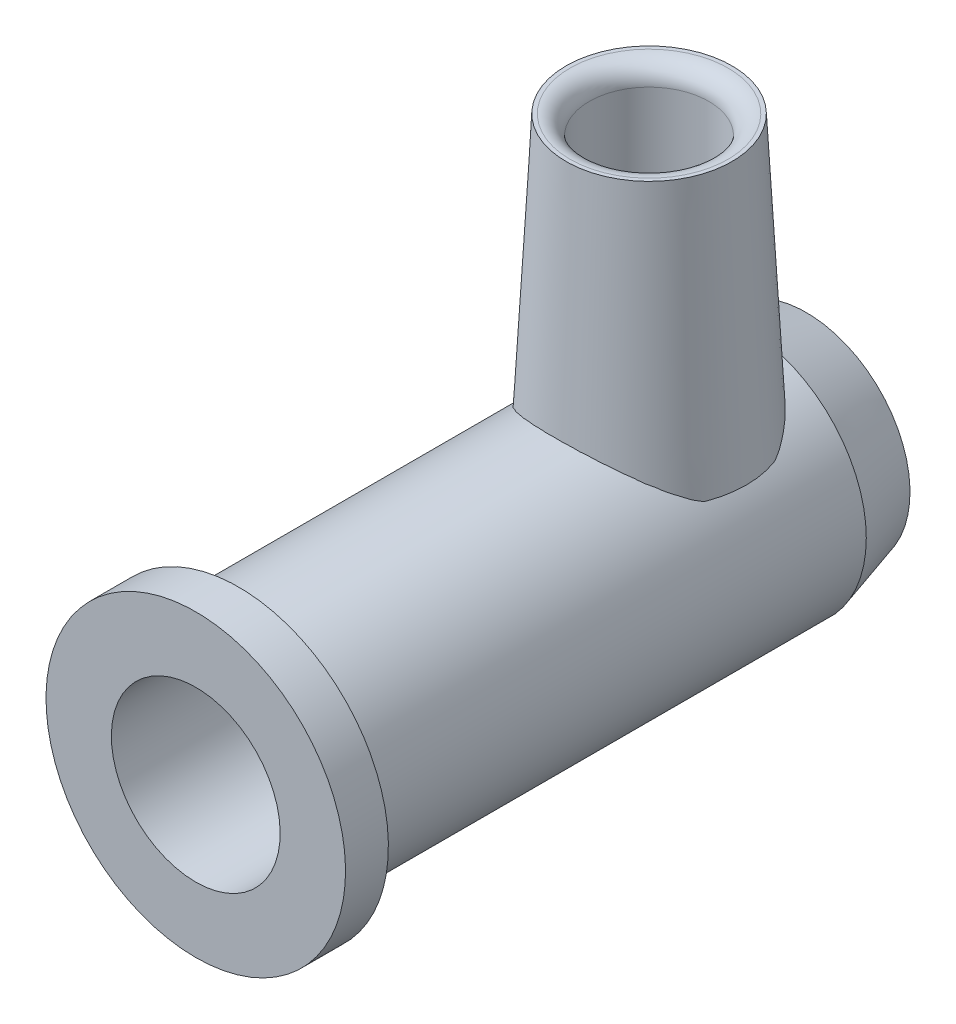
ISO-10303-21;
HEADER;
FILE_DESCRIPTION(('STEP AP214'),'2;1');
FILE_NAME('part.step','',(''),(''),'','','');
FILE_SCHEMA(('AUTOMOTIVE_DESIGN { 1 0 10303 214 1 1 1 1 }'));
ENDSEC;
DATA;
#1=APPLICATION_CONTEXT('core data for automotive mechanical design processes');
#2=APPLICATION_PROTOCOL_DEFINITION('international standard','automotive_design',2000,#1);
#3=PRODUCT_CONTEXT('',#1,'mechanical');
#4=PRODUCT('Part','Part','',(#3));
#5=PRODUCT_RELATED_PRODUCT_CATEGORY('part','',(#4));
#6=PRODUCT_DEFINITION_FORMATION('','',#4);
#7=PRODUCT_DEFINITION_CONTEXT('part definition',#1,'design');
#8=PRODUCT_DEFINITION('design','',#6,#7);
#9=PRODUCT_DEFINITION_SHAPE('','',#8);
#10=(LENGTH_UNIT() NAMED_UNIT(*) SI_UNIT(.MILLI.,.METRE.));
#11=(NAMED_UNIT(*) PLANE_ANGLE_UNIT() SI_UNIT($,.RADIAN.));
#12=(NAMED_UNIT(*) SI_UNIT($,.STERADIAN.) SOLID_ANGLE_UNIT());
#13=UNCERTAINTY_MEASURE_WITH_UNIT(LENGTH_MEASURE(1.E-05),#10,'distance_accuracy_value','');
#14=(GEOMETRIC_REPRESENTATION_CONTEXT(3) GLOBAL_UNCERTAINTY_ASSIGNED_CONTEXT((#13)) GLOBAL_UNIT_ASSIGNED_CONTEXT((#10,
#11,#12)) REPRESENTATION_CONTEXT('',''));
#15=CARTESIAN_POINT('',(0.,0.,0.));
#16=DIRECTION('',(0.,0.,1.));
#17=DIRECTION('',(1.,0.,0.));
#18=AXIS2_PLACEMENT_3D('',#15,#16,#17);
#19=CARTESIAN_POINT('',(0.,29.8061806158723,6.76268689607991));
#20=DIRECTION('',(0.,1.,0.));
#21=DIRECTION('',(0.,0.,1.));
#22=AXIS2_PLACEMENT_3D('',#19,#20,#21);
#23=PLANE('',#22);
#24=CARTESIAN_POINT('',(0.,29.8061806158723,6.76268689607991));
#25=DIRECTION('',(0.,1.,0.));
#26=DIRECTION('',(0.,0.,1.));
#27=AXIS2_PLACEMENT_3D('',#24,#25,#26);
#28=CIRCLE('',#27,2.95015);
#29=CARTESIAN_POINT('',(0.,29.8061806158723,9.71283689607991));
#30=VERTEX_POINT('',#29);
#31=EDGE_CURVE('E11',#30,#30,#28,.F.);
#32=ORIENTED_EDGE('',*,*,#31,.T.);
#33=EDGE_LOOP('',(#32));
#34=FACE_BOUND('',#33,.T.);
#35=CARTESIAN_POINT('',(0.,29.8061806158723,6.76268689607991));
#36=DIRECTION('',(0.,1.,0.));
#37=DIRECTION('',(-1.,0.,0.));
#38=AXIS2_PLACEMENT_3D('',#35,#36,#37);
#39=CIRCLE('',#38,3.09657639803037);
#40=CARTESIAN_POINT('',(-3.09657639803037,29.8061806158723,6.76268689607991));
#41=VERTEX_POINT('',#40);
#42=EDGE_CURVE('E80',#41,#41,#39,.T.);
#43=ORIENTED_EDGE('',*,*,#42,.T.);
#44=EDGE_LOOP('',(#43));
#45=FACE_BOUND('',#44,.T.);
#46=ADVANCED_FACE('F57',(#34,#45),#23,.T.);
#47=CARTESIAN_POINT('',(0.,29.8061806158723,6.76268689607991));
#48=DIRECTION('',(0.,-1.,0.));
#49=DIRECTION('',(0.,0.,-1.));
#50=AXIS2_PLACEMENT_3D('',#47,#48,#49);
#51=CYLINDRICAL_SURFACE('',#50,2.23165);
#52=CARTESIAN_POINT('',(0.,29.0876806158723,6.76268689607991));
#53=DIRECTION('',(0.,1.,0.));
#54=DIRECTION('',(0.,0.,1.));
#55=AXIS2_PLACEMENT_3D('',#52,#53,#54);
#56=CIRCLE('',#55,2.23165);
#57=CARTESIAN_POINT('',(0.,29.0876806158723,8.99433689607991));
#58=VERTEX_POINT('',#57);
#59=EDGE_CURVE('E64',#58,#58,#56,.T.);
#60=ORIENTED_EDGE('',*,*,#59,.T.);
#61=EDGE_LOOP('',(#60));
#62=FACE_BOUND('',#61,.T.);
#63=CARTESIAN_POINT('',(0.,21.1161806158723,6.76268689607991));
#64=DIRECTION('',(0.,1.,0.));
#65=DIRECTION('',(0.,0.,1.));
#66=AXIS2_PLACEMENT_3D('',#63,#64,#65);
#67=CIRCLE('',#66,2.23165);
#68=CARTESIAN_POINT('',(0.,21.1161806158723,8.99433689607991));
#69=VERTEX_POINT('',#68);
#70=EDGE_CURVE('E68',#69,#69,#67,.T.);
#71=ORIENTED_EDGE('',*,*,#70,.F.);
#72=EDGE_LOOP('',(#71));
#73=FACE_BOUND('',#72,.T.);
#74=ADVANCED_FACE('F88',(#62,#73),#51,.F.);
#75=CARTESIAN_POINT('',(0.,21.1161806158723,6.76268689607991));
#76=DIRECTION('',(0.,-1.,0.));
#77=DIRECTION('',(-1.,0.,0.));
#78=AXIS2_PLACEMENT_3D('',#75,#76,#77);
#79=CONICAL_SURFACE('',#78,3.552,0.05235987755983);
#80=CARTESIAN_POINT('',(0.,19.6161806158723,6.76268689607991));
#81=DIRECTION('',(0.,1.,0.));
#82=DIRECTION('',(-1.,0.,0.));
#83=AXIS2_PLACEMENT_3D('',#80,#81,#82);
#84=CIRCLE('',#83,3.63061166892456);
#85=CARTESIAN_POINT('',(-3.63061166892456,19.6161806158723,6.76268689607991));
#86=VERTEX_POINT('',#85);
#87=EDGE_CURVE('E72',#86,#86,#84,.T.);
#88=ORIENTED_EDGE('',*,*,#87,.T.);
#89=EDGE_LOOP('',(#88));
#90=FACE_BOUND('',#89,.T.);
#91=ORIENTED_EDGE('',*,*,#42,.F.);
#92=EDGE_LOOP('',(#91));
#93=FACE_BOUND('',#92,.T.);
#94=ADVANCED_FACE('F85',(#90,#93),#79,.T.);
#95=CARTESIAN_POINT('',(0.,19.6161806158723,6.76268689607991));
#96=DIRECTION('',(0.,1.,0.));
#97=DIRECTION('',(-1.,0.,0.));
#98=AXIS2_PLACEMENT_3D('',#95,#96,#97);
#99=PLANE('',#98);
#100=CARTESIAN_POINT('',(0.,19.6161806158723,6.76268689607991));
#101=DIRECTION('',(0.,1.,0.));
#102=DIRECTION('',(-1.,0.,0.));
#103=AXIS2_PLACEMENT_3D('',#100,#101,#102);
#104=CIRCLE('',#103,2.15303833107544);
#105=CARTESIAN_POINT('',(-2.15303833107544,19.6161806158723,6.76268689607991));
#106=VERTEX_POINT('',#105);
#107=EDGE_CURVE('E77',#106,#106,#104,.T.);
#108=ORIENTED_EDGE('',*,*,#107,.T.);
#109=EDGE_LOOP('',(#108));
#110=FACE_BOUND('',#109,.T.);
#111=ORIENTED_EDGE('',*,*,#87,.F.);
#112=EDGE_LOOP('',(#111));
#113=FACE_BOUND('',#112,.T.);
#114=ADVANCED_FACE('F87',(#110,#113),#99,.F.);
#115=CARTESIAN_POINT('',(0.,21.1161806158723,6.76268689607991));
#116=DIRECTION('',(0.,1.,0.));
#117=DIRECTION('',(-1.,0.,0.));
#118=AXIS2_PLACEMENT_3D('',#115,#116,#117);
#119=CONICAL_SURFACE('',#118,2.23165,0.05235987755983);
#120=ORIENTED_EDGE('',*,*,#70,.T.);
#121=EDGE_LOOP('',(#120));
#122=FACE_BOUND('',#121,.T.);
#123=ORIENTED_EDGE('',*,*,#107,.F.);
#124=EDGE_LOOP('',(#123));
#125=FACE_BOUND('',#124,.T.);
#126=ADVANCED_FACE('F94',(#122,#125),#119,.F.);
#127=CARTESIAN_POINT('',(0.,29.0876806158723,6.76268689607991));
#128=DIRECTION('',(0.,1.,0.));
#129=DIRECTION('',(0.,0.,1.));
#130=AXIS2_PLACEMENT_3D('',#127,#128,#129);
#131=TOROIDAL_SURFACE('',#130,2.95015,0.7185);
#132=ORIENTED_EDGE('',*,*,#31,.F.);
#133=EDGE_LOOP('',(#132));
#134=FACE_BOUND('',#133,.T.);
#135=ORIENTED_EDGE('',*,*,#59,.F.);
#136=EDGE_LOOP('',(#135));
#137=FACE_BOUND('',#136,.T.);
#138=ADVANCED_FACE('F59',(#134,#137),#131,.T.);
#139=CLOSED_SHELL('',(#46,#74,#94,#114,#126,#138));
#140=MANIFOLD_SOLID_BREP('B2',#139);
#141=CARTESIAN_POINT('',(0.,16.5755186730847,25.7651293089935));
#142=DIRECTION('',(0.,0.,1.));
#143=DIRECTION('',(0.,-1.,0.));
#144=AXIS2_PLACEMENT_3D('',#141,#142,#143);
#145=CYLINDRICAL_SURFACE('',#144,5.59);
#146=CARTESIAN_POINT('',(0.,16.5755186730847,22.0826868960799));
#147=DIRECTION('',(0.,0.,1.));
#148=DIRECTION('',(0.,-1.,0.));
#149=AXIS2_PLACEMENT_3D('',#146,#147,#148);
#150=CIRCLE('',#149,5.59);
#151=CARTESIAN_POINT('',(0.,10.9855186730847,22.0826868960799));
#152=VERTEX_POINT('',#151);
#153=EDGE_CURVE('E182',#152,#152,#150,.T.);
#154=ORIENTED_EDGE('',*,*,#153,.T.);
#155=EDGE_LOOP('',(#154));
#156=FACE_BOUND('',#155,.T.);
#157=CARTESIAN_POINT('',(0.,16.5755186730847,23.6826868960799));
#158=DIRECTION('',(0.,0.,1.));
#159=DIRECTION('',(0.,-1.,0.));
#160=AXIS2_PLACEMENT_3D('',#157,#158,#159);
#161=CIRCLE('',#160,5.59);
#162=CARTESIAN_POINT('',(0.,10.9855186730847,23.6826868960799));
#163=VERTEX_POINT('',#162);
#164=EDGE_CURVE('E191',#163,#163,#161,.T.);
#165=ORIENTED_EDGE('',*,*,#164,.F.);
#166=EDGE_LOOP('',(#165));
#167=FACE_BOUND('',#166,.T.);
#168=ADVANCED_FACE('F152',(#156,#167),#145,.T.);
#169=CARTESIAN_POINT('',(0.,10.9855186730847,22.0826868960799));
#170=DIRECTION('',(0.,0.,-1.));
#171=DIRECTION('',(0.,1.,0.));
#172=AXIS2_PLACEMENT_3D('',#169,#170,#171);
#173=PLANE('',#172);
#174=CARTESIAN_POINT('',(0.,16.5755186730847,22.0826868960799));
#175=DIRECTION('',(0.,0.,1.));
#176=DIRECTION('',(0.,-1.,0.));
#177=AXIS2_PLACEMENT_3D('',#174,#175,#176);
#178=CIRCLE('',#177,4.54066194278755);
#179=CARTESIAN_POINT('',(0.,12.0348567302972,22.0826868960799));
#180=VERTEX_POINT('',#179);
#181=EDGE_CURVE('E214',#180,#180,#178,.T.);
#182=ORIENTED_EDGE('',*,*,#181,.T.);
#183=EDGE_LOOP('',(#182));
#184=FACE_BOUND('',#183,.T.);
#185=ORIENTED_EDGE('',*,*,#153,.F.);
#186=EDGE_LOOP('',(#185));
#187=FACE_BOUND('',#186,.T.);
#188=ADVANCED_FACE('F223',(#184,#187),#173,.T.);
#189=CARTESIAN_POINT('',(0.,16.5755186730847,25.7651293089935));
#190=DIRECTION('',(0.,0.,1.));
#191=DIRECTION('',(0.,-1.,0.));
#192=AXIS2_PLACEMENT_3D('',#189,#190,#191);
#193=CYLINDRICAL_SURFACE('',#192,4.54066194278755);
#194=CARTESIAN_POINT('',(-2.23165,20.5299274982037,6.76268689607991));
#195=CARTESIAN_POINT('',(-2.23164095314419,20.5299383244512,6.87927581101539));
#196=CARTESIAN_POINT('',(-2.22245219435208,20.5351620440469,6.99602333077688));
#197=CARTESIAN_POINT('',(-2.18615144640278,20.5553121418181,7.22595728341037));
#198=CARTESIAN_POINT('',(-2.15900051728307,20.5702595987839,7.33913541853749));
#199=CARTESIAN_POINT('',(-2.08821416130668,20.6077081192122,7.55817667453163));
#200=CARTESIAN_POINT('',(-2.04466404277252,20.630170026282,7.66407435332051));
#201=CARTESIAN_POINT('',(-1.94257504555127,20.6800564932529,7.8670340532073));
#202=CARTESIAN_POINT('',(-1.88403579844574,20.7074811751294,7.96409585704835));
#203=CARTESIAN_POINT('',(-1.7481670907413,20.7668713944891,8.1551609557438));
#204=CARTESIAN_POINT('',(-1.66971337183432,20.7990246070644,8.24830682675954));
#205=CARTESIAN_POINT('',(-1.49858315443303,20.8627319001881,8.42078196815478));
#206=CARTESIAN_POINT('',(-1.40589980347436,20.8942856838027,8.50010454224183));
#207=CARTESIAN_POINT('',(-1.20162165774761,20.9556778935301,8.64769098657378));
#208=CARTESIAN_POINT('',(-1.08919203860061,20.9852738890338,8.71490966122146));
#209=CARTESIAN_POINT('',(-0.852894000173005,21.0369947911009,8.82908936143857));
#210=CARTESIAN_POINT('',(-0.729032617189068,21.0591242548019,8.87606274843058));
#211=CARTESIAN_POINT('',(-0.482463033510655,21.0920686974689,8.94505420461192));
#212=CARTESIAN_POINT('',(-0.360267194409806,21.1035601700147,8.96857312780836));
#213=CARTESIAN_POINT('',(-0.11316443994599,21.1164520928663,8.99492069465956));
#214=CARTESIAN_POINT('',(0.0117408557111758,21.1178584139102,8.99776137548513));
#215=CARTESIAN_POINT('',(0.249474307710772,21.1107509384672,8.98327392254568));
#216=CARTESIAN_POINT('',(0.362434796280891,21.1030613945624,8.96762172640569));
#217=CARTESIAN_POINT('',(0.583884379878533,21.0798596716859,8.91957816354691));
#218=CARTESIAN_POINT('',(0.692373140524734,21.0643469088631,8.88718554747681));
#219=CARTESIAN_POINT('',(0.903725360574116,21.0266521668057,8.8063436207077));
#220=CARTESIAN_POINT('',(1.00648722759677,21.0043787290292,8.75767311931157));
#221=CARTESIAN_POINT('',(1.20263890233141,20.9551888729939,8.64594881358811));
#222=CARTESIAN_POINT('',(1.29602530354745,20.9282707767264,8.58288980836038));
#223=CARTESIAN_POINT('',(1.47995261664581,20.8694111323533,8.43749472566252));
#224=CARTESIAN_POINT('',(1.56943855776322,20.8372352522338,8.35391783207132));
#225=CARTESIAN_POINT('',(1.73368255527764,20.7731067027715,8.17319509283591));
#226=CARTESIAN_POINT('',(1.8084299430807,20.7411542111494,8.07603950446345));
#227=CARTESIAN_POINT('',(1.94543781289374,20.679039089712,7.86378586424098));
#228=CARTESIAN_POINT('',(2.00668453588873,20.6490976895604,7.74796236137594));
#229=CARTESIAN_POINT('',(2.10836231655825,20.5974219060408,7.50583162591815));
#230=CARTESIAN_POINT('',(2.14881447525235,20.5756792091384,7.37953517239759));
#231=CARTESIAN_POINT('',(2.20453522416153,20.5452260335474,7.13047167622944));
#232=CARTESIAN_POINT('',(2.22152784235726,20.5356283513564,7.00820273030085));
#233=CARTESIAN_POINT('',(2.23504056275008,20.5280218087882,6.76221181697989));
#234=CARTESIAN_POINT('',(2.23157404110226,20.530005376598,6.63849085171809));
#235=CARTESIAN_POINT('',(2.20584917862315,20.5443979597626,6.4068005704136));
#236=CARTESIAN_POINT('',(2.18558140002163,20.5557019857334,6.29853059407867));
#237=CARTESIAN_POINT('',(2.12974921432497,20.5858525657575,6.08712016919687));
#238=CARTESIAN_POINT('',(2.09418005682331,20.6047014620355,5.98398132474427));
#239=CARTESIAN_POINT('',(2.00700516340431,20.6488495064017,5.78032669946752));
#240=CARTESIAN_POINT('',(1.95473155944625,20.6744074943604,5.680155017612));
#241=CARTESIAN_POINT('',(1.83622087084628,20.7288491402043,5.48943300876468));
#242=CARTESIAN_POINT('',(1.76997665480996,20.7577344931352,5.39888763122678));
#243=CARTESIAN_POINT('',(1.61603164144498,20.8197776856849,5.21853562308793));
#244=CARTESIAN_POINT('',(1.52670471901544,20.853029705676,5.13014305586737));
#245=CARTESIAN_POINT('',(1.33392736230289,20.9170115048806,4.96917892904806));
#246=CARTESIAN_POINT('',(1.23047267560927,20.9477405202017,4.89661215010395));
#247=CARTESIAN_POINT('',(1.00904500207698,21.0041496255696,4.76798253159981));
#248=CARTESIAN_POINT('',(0.890791978535985,21.0296967755092,4.7123393871765));
#249=CARTESIAN_POINT('',(0.644988353657957,21.0718613585502,4.62227961368046));
#250=CARTESIAN_POINT('',(0.517445745310373,21.0884863677664,4.58784497201474));
#251=CARTESIAN_POINT('',(0.269040468507309,21.1097614353717,4.54405354032891));
#252=CARTESIAN_POINT('',(0.148605326148576,21.1153521565271,4.53272375115));
#253=CARTESIAN_POINT('',(-0.0925540201675414,21.1168360956571,4.52970200750006));
#254=CARTESIAN_POINT('',(-0.213278116917651,21.112732479007,4.53800364301732));
#255=CARTESIAN_POINT('',(-0.443686803612518,21.0958372086424,4.57267900930232));
#256=CARTESIAN_POINT('',(-0.553590692314388,21.083602510721,4.59789511814186));
#257=CARTESIAN_POINT('',(-0.767443979486391,21.0521613707196,4.6641566960385));
#258=CARTESIAN_POINT('',(-0.87139249319561,21.0329538958219,4.70520451016654));
#259=CARTESIAN_POINT('',(-1.07546871760188,20.9882692132895,4.80385229006088));
#260=CARTESIAN_POINT('',(-1.17523151009425,20.9625548980863,4.86209663310791));
#261=CARTESIAN_POINT('',(-1.36398885395036,20.9075881060151,4.99266319853826));
#262=CARTESIAN_POINT('',(-1.45297841581971,20.8783340021818,5.06499190378356));
#263=CARTESIAN_POINT('',(-1.6267056842849,20.8158913494397,5.22979171781957));
#264=CARTESIAN_POINT('',(-1.71020432827075,20.7825955533442,5.32353304447512));
#265=CARTESIAN_POINT('',(-1.860710401958,20.7182328994428,5.52422708602368));
#266=CARTESIAN_POINT('',(-1.92770407141581,20.6871679166554,5.63119071357726));
#267=CARTESIAN_POINT('',(-2.04474559848781,20.6302696004204,5.85931239270491));
#268=CARTESIAN_POINT('',(-2.09429652752632,20.6045969956644,5.98077182144112));
#269=CARTESIAN_POINT('',(-2.15221521425044,20.5737740240394,6.16893017442956));
#270=CARTESIAN_POINT('',(-2.16877918048873,20.5647853908555,6.23258378281451));
#271=CARTESIAN_POINT('',(-2.1962635579718,20.5497213879184,6.36142069673177));
#272=CARTESIAN_POINT('',(-2.20718796220182,20.5436439571637,6.42660288570235));
#273=CARTESIAN_POINT('',(-2.22067020636876,20.5361086194756,6.53702514595378));
#274=CARTESIAN_POINT('',(-2.22478329730473,20.5337965955368,6.58202433977261));
#275=CARTESIAN_POINT('',(-2.23027503660906,20.5307038856506,6.67223668623508));
#276=CARTESIAN_POINT('',(-2.23165351022232,20.5299232975691,6.71744985236751));
#277=CARTESIAN_POINT('',(-2.23165,20.5299274982037,6.76268689607991));
#278=B_SPLINE_CURVE_WITH_KNOTS('',3,(#194,#195,#196,#197,#198,#199,#200,#201,#202,#203,#204,
#205,#206,#207,#208,#209,#210,#211,#212,#213,#214,#215,#216,#217,#218,#219,#220,#221,#222,#223,
#224,#225,#226,#227,#228,#229,#230,#231,#232,#233,#234,#235,#236,#237,#238,#239,#240,#241,#242,
#243,#244,#245,#246,#247,#248,#249,#250,#251,#252,#253,#254,#255,#256,#257,#258,#259,#260,#261,
#262,#263,#264,#265,#266,#267,#268,#269,#270,#271,#272,#273,#274,#275,#276,#277),.UNSPECIFIED.,
.T.,.F.,(4,2,2,2,2,2,2,2,2,2,2,2,2,2,2,2,2,2,2,2,2,2,2,2,2,2,2,2,2,2,2,2,2,2,2,2,2,2,2,2,2,4),
(0.,0.349584288259429,0.699928930263591,1.04847571235628,1.39703106221801,1.7733119685744,
2.14977464957416,2.55055288903768,2.9510860723652,3.32392656332367,3.69654999986536,
4.03783898617562,4.37915344684259,4.72530819813788,5.07158827006367,5.44977385248301,
5.82823218996093,6.22931778585427,6.62999557782216,6.99929684843668,7.36835669719011,
7.69905854779324,8.02986314098302,8.37602615322795,8.72236629630211,9.11059830549044,
9.49894742986843,9.89626217293997,10.2932390056291,10.6545948316301,11.0158326847756,
11.3545746964833,11.6933669036249,12.0469496160318,12.4006954646469,12.7885788694822,
13.1767845677262,13.5752932128453,13.7741854027421,13.9729365769737,14.1085682468864,
14.2442085840309),.UNSPECIFIED.);
#279=CARTESIAN_POINT('',(0.,21.1161806158723,8.99433689607991));
#280=VERTEX_POINT('',#279);
#281=CARTESIAN_POINT('',(0.,21.1161806158723,4.53103689607991));
#282=VERTEX_POINT('',#281);
#283=EDGE_CURVE('E55',#280,#282,#278,.T.);
#284=ORIENTED_EDGE('',*,*,#283,.F.);
#285=EDGE_CURVE('E155',#282,#280,#278,.T.);
#286=ORIENTED_EDGE('',*,*,#285,.F.);
#287=EDGE_LOOP('',(#284,#286));
#288=FACE_BOUND('',#287,.T.);
#289=CARTESIAN_POINT('',(0.,16.5755186730847,3.1946868960799));
#290=DIRECTION('',(0.,0.,1.));
#291=DIRECTION('',(0.,-1.,0.));
#292=AXIS2_PLACEMENT_3D('',#289,#290,#291);
#293=CIRCLE('',#292,4.54066194278755);
#294=CARTESIAN_POINT('',(0.,12.0348567302972,3.1946868960799));
#295=VERTEX_POINT('',#294);
#296=EDGE_CURVE('E210',#295,#295,#293,.T.);
#297=ORIENTED_EDGE('',*,*,#296,.T.);
#298=EDGE_LOOP('',(#297));
#299=FACE_BOUND('',#298,.T.);
#300=ORIENTED_EDGE('',*,*,#181,.F.);
#301=EDGE_LOOP('',(#300));
#302=FACE_BOUND('',#301,.T.);
#303=ADVANCED_FACE('F171',(#288,#299,#302),#193,.T.);
#304=CARTESIAN_POINT('',(0.,16.5755186730847,3.1946868960799));
#305=DIRECTION('',(0.,0.,1.));
#306=DIRECTION('',(0.,-1.,0.));
#307=AXIS2_PLACEMENT_3D('',#304,#305,#306);
#308=CONICAL_SURFACE('',#307,4.54066194278755,0.283491930751028);
#309=CARTESIAN_POINT('',(0.,16.5755186730847,0.892686896079908));
#310=DIRECTION('',(0.,0.,1.));
#311=DIRECTION('',(0.,-1.,0.));
#312=AXIS2_PLACEMENT_3D('',#309,#310,#311);
#313=CIRCLE('',#312,3.87000000000001);
#314=CARTESIAN_POINT('',(0.,12.7055186730847,0.892686896079908));
#315=VERTEX_POINT('',#314);
#316=EDGE_CURVE('E206',#315,#315,#313,.T.);
#317=ORIENTED_EDGE('',*,*,#316,.T.);
#318=EDGE_LOOP('',(#317));
#319=FACE_BOUND('',#318,.T.);
#320=ORIENTED_EDGE('',*,*,#296,.F.);
#321=EDGE_LOOP('',(#320));
#322=FACE_BOUND('',#321,.T.);
#323=ADVANCED_FACE('F231',(#319,#322),#308,.T.);
#324=CARTESIAN_POINT('',(0.,12.7055186730847,0.892686896079908));
#325=DIRECTION('',(0.,0.,-1.));
#326=DIRECTION('',(0.,1.,0.));
#327=AXIS2_PLACEMENT_3D('',#324,#325,#326);
#328=PLANE('',#327);
#329=CARTESIAN_POINT('',(0.,16.5755186730847,0.892686896079908));
#330=DIRECTION('',(0.,0.,1.));
#331=DIRECTION('',(0.,-1.,0.));
#332=AXIS2_PLACEMENT_3D('',#329,#330,#331);
#333=CIRCLE('',#332,3.15);
#334=CARTESIAN_POINT('',(0.,13.4255186730847,0.892686896079908));
#335=VERTEX_POINT('',#334);
#336=EDGE_CURVE('E202',#335,#335,#333,.T.);
#337=ORIENTED_EDGE('',*,*,#336,.T.);
#338=EDGE_LOOP('',(#337));
#339=FACE_BOUND('',#338,.T.);
#340=ORIENTED_EDGE('',*,*,#316,.F.);
#341=EDGE_LOOP('',(#340));
#342=FACE_BOUND('',#341,.T.);
#343=ADVANCED_FACE('F235',(#339,#342),#328,.T.);
#344=CARTESIAN_POINT('',(0.,16.5755186730847,25.7651293089935));
#345=DIRECTION('',(0.,0.,1.));
#346=DIRECTION('',(0.,-1.,0.));
#347=AXIS2_PLACEMENT_3D('',#344,#345,#346);
#348=CYLINDRICAL_SURFACE('',#347,3.15);
#349=CARTESIAN_POINT('',(0.,13.4255186730847,5.22268689607991));
#350=CARTESIAN_POINT('',(-0.0811750226638904,13.4255229014196,5.22269181864257));
#351=CARTESIAN_POINT('',(-0.162453194694666,13.4286904491245,5.2291428943405));
#352=CARTESIAN_POINT('',(-0.322620839125244,13.441048998415,5.2546682618254));
#353=CARTESIAN_POINT('',(-0.401505179584842,13.4502520993968,5.27376791079997));
#354=CARTESIAN_POINT('',(-0.55432120802518,13.4737156313306,5.32367213620284));
#355=CARTESIAN_POINT('',(-0.628270593857936,13.4879566916733,5.3544319122014));
#356=CARTESIAN_POINT('',(-0.769856044314784,13.5201789051328,5.42655817824399));
#357=CARTESIAN_POINT('',(-0.83749279006094,13.538159654067,5.46792352215818));
#358=CARTESIAN_POINT('',(-0.968991896740787,13.5774300389313,5.5628492143087));
#359=CARTESIAN_POINT('',(-1.03240098233834,13.5988518134684,5.61698203893657));
#360=CARTESIAN_POINT('',(-1.14965472347871,13.6421404475898,5.73467767219691));
#361=CARTESIAN_POINT('',(-1.20349243328993,13.6640076176656,5.79824726799263));
#362=CARTESIAN_POINT('',(-1.3040245566394,13.7075510511465,5.93860889712498));
#363=CARTESIAN_POINT('',(-1.34990623195815,13.7290958604443,6.01602854906806));
#364=CARTESIAN_POINT('',(-1.42780350362072,13.7673567434449,6.17865796059705));
#365=CARTESIAN_POINT('',(-1.45982867184362,13.7840761478023,6.26386229319976));
#366=CARTESIAN_POINT('',(-1.507076009575,13.8093107919512,6.43452549032715));
#367=CARTESIAN_POINT('',(-1.52317353868485,13.8182497059927,6.51967631943212));
#368=CARTESIAN_POINT('',(-1.54079967122265,13.8280562073909,6.69190104670738));
#369=CARTESIAN_POINT('',(-1.54234156695583,13.8289311587968,6.77897311752257));
#370=CARTESIAN_POINT('',(-1.53145668143801,13.8228545388761,6.94199432522679));
#371=CARTESIAN_POINT('',(-1.52058966370974,13.8167767477051,7.01808790711926));
#372=CARTESIAN_POINT('',(-1.4878855121457,13.7990029595217,7.1671927857685));
#373=CARTESIAN_POINT('',(-1.46604513157398,13.7873052997797,7.24020316334963));
#374=CARTESIAN_POINT('',(-1.4116031532345,13.7593462182203,7.3831431602608));
#375=CARTESIAN_POINT('',(-1.37876248745335,13.7429847335122,7.45296123581274));
#376=CARTESIAN_POINT('',(-1.30343248592544,13.7075412212938,7.586423827749));
#377=CARTESIAN_POINT('',(-1.26093883818523,13.6884579793948,7.65006556697181));
#378=CARTESIAN_POINT('',(-1.16153164750742,13.6469389915284,7.77744404207215));
#379=CARTESIAN_POINT('',(-1.10349744929506,13.6243763850322,7.84026785273383));
#380=CARTESIAN_POINT('',(-0.977602590605205,13.5803156443005,7.95566151594147));
#381=CARTESIAN_POINT('',(-0.909737645052301,13.5588179797695,8.00822687340744));
#382=CARTESIAN_POINT('',(-0.762430742653692,13.5181875697308,8.10370171521113));
#383=CARTESIAN_POINT('',(-0.682618824398829,13.4991945389378,8.14610461383486));
#384=CARTESIAN_POINT('',(-0.515829335584364,13.4668834668679,8.21654287526391));
#385=CARTESIAN_POINT('',(-0.428857276051068,13.4535611088241,8.24458917025819));
#386=CARTESIAN_POINT('',(-0.257711384112537,13.4349947267559,8.28329641349092));
#387=CARTESIAN_POINT('',(-0.173874077413556,13.4291876932171,8.29517304384764));
#388=CARTESIAN_POINT('',(-0.00520722027072472,13.4243954134054,8.30499015510634));
#389=CARTESIAN_POINT('',(0.0796218736715581,13.4254071431233,8.30293681371898));
#390=CARTESIAN_POINT('',(0.241255463498452,13.4338042735979,8.28568276179417));
#391=CARTESIAN_POINT('',(0.31819210291181,13.4407166317626,8.27145764480923));
#392=CARTESIAN_POINT('',(0.468441415084598,13.4596241364688,8.23176901626741));
#393=CARTESIAN_POINT('',(0.541753679205283,13.471619854693,8.20630424066754));
#394=CARTESIAN_POINT('',(0.685161242653909,13.500041751105,8.14415098460734));
#395=CARTESIAN_POINT('',(0.755098234776427,13.5165879943577,8.1071540727606));
#396=CARTESIAN_POINT('',(0.888009493272372,13.5524926764732,8.02332950587047));
#397=CARTESIAN_POINT('',(0.950980726196998,13.571852332096,7.97649759341171));
#398=CARTESIAN_POINT('',(1.07449750648671,13.6136613485593,7.86919787552815));
#399=CARTESIAN_POINT('',(1.13424690608155,13.6362296166204,7.80785817907333));
#400=CARTESIAN_POINT('',(1.24294523951049,13.6805162108102,7.67592249340241));
#401=CARTESIAN_POINT('',(1.29188750954352,13.7022340057761,7.60532083568176));
#402=CARTESIAN_POINT('',(1.37952489966896,13.7432306009038,7.45301374752177));
#403=CARTESIAN_POINT('',(1.41769242509016,13.7623654184194,7.37096263026549));
#404=CARTESIAN_POINT('',(1.47926999080117,13.7942453519337,7.20035992489361));
#405=CARTESIAN_POINT('',(1.50269819313984,13.8069983277661,7.11181648761455));
#406=CARTESIAN_POINT('',(1.5320416508135,13.8231372407098,6.93970234364599));
#407=CARTESIAN_POINT('',(1.53940142786482,13.827293820677,6.8564513224222));
#408=CARTESIAN_POINT('',(1.54052752945954,13.8279235125212,6.68984191641798));
#409=CARTESIAN_POINT('',(1.53429893992593,13.8243994991303,6.6064835834738));
#410=CARTESIAN_POINT('',(1.50976008304721,13.810868727922,6.44968345194853));
#411=CARTESIAN_POINT('',(1.49255293722776,13.8014552677191,6.37601156275341));
#412=CARTESIAN_POINT('',(1.44786640978942,13.7778737172849,6.23266486069883));
#413=CARTESIAN_POINT('',(1.42038382619735,13.7637041451221,6.16299130159069));
#414=CARTESIAN_POINT('',(1.35384695638808,13.7310403661855,6.02444793259979));
#415=CARTESIAN_POINT('',(1.31413896266786,13.7123194712651,5.95594702239222));
#416=CARTESIAN_POINT('',(1.22502483551469,13.673074181014,5.82614044449284));
#417=CARTESIAN_POINT('',(1.1756137969393,13.652548876418,5.76483844118791));
#418=CARTESIAN_POINT('',(1.06186746354126,13.6091999186622,5.64389710205309));
#419=CARTESIAN_POINT('',(0.99647214514954,13.5863815266659,5.58524744225227));
#420=CARTESIAN_POINT('',(0.856091846304387,13.5431936496296,5.47955595780963));
#421=CARTESIAN_POINT('',(0.7811019762248,13.5228254235971,5.43252008790937));
#422=CARTESIAN_POINT('',(0.623059301498485,13.486686775035,5.35155270777378));
#423=CARTESIAN_POINT('',(0.539987285315283,13.4709276829124,5.31765342524685));
#424=CARTESIAN_POINT('',(0.368437678749995,13.4459485823112,5.26473475463008));
#425=CARTESIAN_POINT('',(0.27997651861126,13.4367096823147,5.24567236168592));
#426=CARTESIAN_POINT('',(0.158891038669534,13.4293677137214,5.23057331463043));
#427=CARTESIAN_POINT('',(0.127207622609459,13.4279277648857,5.22761973044011));
#428=CARTESIAN_POINT('',(0.063688100919103,13.4260024023695,5.22367552942407));
#429=CARTESIAN_POINT('',(0.0318519912714756,13.4255170139428,5.22268496453228));
#430=CARTESIAN_POINT('',(0.,13.4255186730847,5.22268689607991));
#431=B_SPLINE_CURVE_WITH_KNOTS('',3,(#349,#350,#351,#352,#353,#354,#355,#356,#357,#358,#359,
#360,#361,#362,#363,#364,#365,#366,#367,#368,#369,#370,#371,#372,#373,#374,#375,#376,#377,#378,
#379,#380,#381,#382,#383,#384,#385,#386,#387,#388,#389,#390,#391,#392,#393,#394,#395,#396,#397,
#398,#399,#400,#401,#402,#403,#404,#405,#406,#407,#408,#409,#410,#411,#412,#413,#414,#415,#416,
#417,#418,#419,#420,#421,#422,#423,#424,#425,#426,#427,#428,#429,#430),.UNSPECIFIED.,.T.,.F.,(4,
2,2,2,2,2,2,2,2,2,2,2,2,2,2,2,2,2,2,2,2,2,2,2,2,2,2,2,2,2,2,2,2,2,2,2,2,2,2,2,4),(0.,
0.243395530813617,0.487280491184209,0.73023774391609,0.973168751635,1.23033208034717,
1.48768127164227,1.76389194228634,2.03991150469295,2.29974199886325,2.55933519104722,
2.78957545513792,3.01988388155493,3.25556295193958,3.49134750806847,3.75554840858363,
4.01986481878605,4.29543834052916,4.57080170670777,4.82404305122695,5.07717209476819,
5.31173061094744,5.54631551294788,5.78780843229205,6.02940610636346,6.29391174338464,
6.55858002500251,6.83456441528864,7.1102080633123,7.35982933654322,7.60935719628319,
7.83708382033559,8.06488146648028,8.30799278344472,8.55122731738205,8.82224421529133,
9.09339978454948,9.36521642509987,9.63624223799157,9.7317448565564,9.82725000171776),.UNSPECIFIED.);
#432=CARTESIAN_POINT('',(0.,13.4255186730847,5.22268689607991));
#433=VERTEX_POINT('',#432);
#434=EDGE_CURVE('E255',#433,#433,#431,.T.);
#435=ORIENTED_EDGE('',*,*,#434,.F.);
#436=EDGE_LOOP('',(#435));
#437=FACE_BOUND('',#436,.T.);
#438=CARTESIAN_POINT('',(-1.54,19.3234087727794,6.76268689607991));
#439=CARTESIAN_POINT('',(-1.53999465548888,19.3234152786842,6.68216706289487));
#440=CARTESIAN_POINT('',(-1.5336431780653,19.3270012338069,6.60153937640273));
#441=CARTESIAN_POINT('',(-1.50855094316055,19.3408336320417,6.44273667259789));
#442=CARTESIAN_POINT('',(-1.48978300291398,19.3510946878057,6.36456743165101));
#443=CARTESIAN_POINT('',(-1.4408459211412,19.3768068496413,6.21327574570815));
#444=CARTESIAN_POINT('',(-1.41073530194174,19.3922312706987,6.14012963628123));
#445=CARTESIAN_POINT('',(-1.34014575744353,19.4264910892426,5.99994512757992));
#446=CARTESIAN_POINT('',(-1.29966667130153,19.4453265396421,5.93290682307615));
#447=CARTESIAN_POINT('',(-1.2057526349829,19.4860990613092,5.80101184054309));
#448=CARTESIAN_POINT('',(-1.15154900844673,19.5081635642837,5.73674161627773));
#449=CARTESIAN_POINT('',(-1.03332526979337,19.5518774533419,5.61775115852572));
#450=CARTESIAN_POINT('',(-0.96930046855174,19.573526635546,5.56303551370367));
#451=CARTESIAN_POINT('',(-0.828260406236415,19.6156225422429,5.46129789649406));
#452=CARTESIAN_POINT('',(-0.750677205520531,19.6359046275587,5.41498875933591));
#453=CARTESIAN_POINT('',(-0.587644716606341,19.6713405168635,5.33634565870813));
#454=CARTESIAN_POINT('',(-0.502200216970458,19.6864974167971,5.30400325514165));
#455=CARTESIAN_POINT('',(-0.332076536463796,19.7090590682879,5.25650602000844));
#456=CARTESIAN_POINT('',(-0.247746172498389,19.7169238850392,5.24032523205412));
#457=CARTESIAN_POINT('',(-0.0772284022671089,19.7257262546251,5.22224077349123));
#458=CARTESIAN_POINT('',(0.00895790789930553,19.7266677895174,5.22032889583686));
#459=CARTESIAN_POINT('',(0.173064473556574,19.7217432994536,5.23042016206745));
#460=CARTESIAN_POINT('',(0.251075696302677,19.7164373277871,5.24127843888627));
#461=CARTESIAN_POINT('',(0.404003762352797,19.7004495939436,5.27456533961464));
#462=CARTESIAN_POINT('',(0.478920374411574,19.6897674308133,5.29699482650139));
#463=CARTESIAN_POINT('',(0.624868632411623,19.6638218982004,5.35295705440431));
#464=CARTESIAN_POINT('',(0.695829543238185,19.6484953009218,5.38664374297236));
#465=CARTESIAN_POINT('',(0.831267577733234,19.6146590589034,5.4639638187571));
#466=CARTESIAN_POINT('',(0.895742338804643,19.5961482609156,5.50760081162767));
#467=CARTESIAN_POINT('',(1.02266290809689,19.5557019553655,5.60817313993642));
#468=CARTESIAN_POINT('',(1.08438457349743,19.5336080675866,5.66595943183311));
#469=CARTESIAN_POINT('',(1.19764188380132,19.4895971292035,5.7908991303419));
#470=CARTESIAN_POINT('',(1.24917028769472,19.4676802148419,5.85805913843055));
#471=CARTESIAN_POINT('',(1.34352699926863,19.4251277514872,6.00468271823518));
#472=CARTESIAN_POINT('',(1.38566730905329,19.404642872556,6.08463702204611));
#473=CARTESIAN_POINT('',(1.45558163532047,19.3693211497994,6.25174372013206));
#474=CARTESIAN_POINT('',(1.4833700796639,19.3544786377087,6.33888878292731));
#475=CARTESIAN_POINT('',(1.52159404022903,19.3337233877144,6.51073207650699));
#476=CARTESIAN_POINT('',(1.53321391661234,19.3272044817725,6.59509105811058));
#477=CARTESIAN_POINT('',(1.54233659129227,19.3221043258296,6.76478624634231));
#478=CARTESIAN_POINT('',(1.53984839907958,19.3235180100265,6.85012179458418));
#479=CARTESIAN_POINT('',(1.52191248964335,19.3334820013213,7.01005441839763));
#480=CARTESIAN_POINT('',(1.50781673666898,19.3412873462059,7.0848568960183));
#481=CARTESIAN_POINT('',(1.46904170879182,19.3620750803365,7.23090528006532));
#482=CARTESIAN_POINT('',(1.44435918714904,19.3750590576748,7.30215008793968));
#483=CARTESIAN_POINT('',(1.3838940962804,19.4054529658577,7.44281206142777));
#484=CARTESIAN_POINT('',(1.34764933660523,19.4230404125233,7.51199076053169));
#485=CARTESIAN_POINT('',(1.26549797727867,19.4604886357623,7.64367782770399));
#486=CARTESIAN_POINT('',(1.21958645484391,19.4803505682542,7.70618277263791));
#487=CARTESIAN_POINT('',(1.11298866154584,19.5229627315903,7.83055322732297));
#488=CARTESIAN_POINT('',(1.05119270865047,19.5457746136761,7.89145085314054));
#489=CARTESIAN_POINT('',(0.917868528774325,19.5896422195466,8.00229745406087));
#490=CARTESIAN_POINT('',(0.846337472407083,19.6106974298961,8.05224323508603));
#491=CARTESIAN_POINT('',(0.693353206643584,19.6492968803928,8.14066800786139));
#492=CARTESIAN_POINT('',(0.611715490806952,19.6667531371685,8.17886885904556));
#493=CARTESIAN_POINT('',(0.442074797344149,19.695526119442,8.2406241525516));
#494=CARTESIAN_POINT('',(0.354077233398105,19.706847998527,8.2641908916608));
#495=CARTESIAN_POINT('',(0.182681046082717,19.7212868801444,8.29406198940915));
#496=CARTESIAN_POINT('',(0.0995712720225373,19.7250450655239,8.30171735664855));
#497=CARTESIAN_POINT('',(-0.0668149786851726,19.7259071237778,8.3034822470177));
#498=CARTESIAN_POINT('',(-0.150091393567917,19.7230131229097,8.29759609846091));
#499=CARTESIAN_POINT('',(-0.30909392965271,19.7112696018789,8.27336032988237));
#500=CARTESIAN_POINT('',(-0.384970234282408,19.7027953695044,8.25579545931114));
#501=CARTESIAN_POINT('',(-0.532588976221519,19.6810651810145,8.20972885555586));
#502=CARTESIAN_POINT('',(-0.604330793186749,19.6678085094905,8.18122548603299));
#503=CARTESIAN_POINT('',(-0.745169415632197,19.6369967118569,8.11276903095272));
#504=CARTESIAN_POINT('',(-0.814011890786242,19.6192784485328,8.07236828208484));
#505=CARTESIAN_POINT('',(-0.94423280588053,19.5814345579206,7.98183440750696));
#506=CARTESIAN_POINT('',(-1.00560778841523,19.561307824014,7.9316968013683));
#507=CARTESIAN_POINT('',(-1.12532420369182,19.5184024162554,7.81754427955839));
#508=CARTESIAN_POINT('',(-1.18281516260945,19.4955541250353,7.75266105291196));
#509=CARTESIAN_POINT('',(-1.28638077467027,19.4514362434081,7.61376445629123));
#510=CARTESIAN_POINT('',(-1.33244606929319,19.430167957071,7.53974367576809));
#511=CARTESIAN_POINT('',(-1.41276174118421,19.3913046112335,7.38213965120503));
#512=CARTESIAN_POINT('',(-1.44668716710265,19.3738149393426,7.29836328186533));
#513=CARTESIAN_POINT('',(-1.49943374213592,19.3459180721877,7.1252153398096));
#514=CARTESIAN_POINT('',(-1.51830553085834,19.3354871497929,7.03586362550846));
#515=CARTESIAN_POINT('',(-1.53274224371275,19.3274652837569,6.91512874840138));
#516=CARTESIAN_POINT('',(-1.53546007488693,19.3259489037874,6.88472973616976));
#517=CARTESIAN_POINT('',(-1.53909002365758,19.3239193823864,6.82378796526705));
#518=CARTESIAN_POINT('',(-1.54000202831,19.3234063037057,6.79324519772462));
#519=CARTESIAN_POINT('',(-1.54,19.3234087727794,6.76268689607991));
#520=B_SPLINE_CURVE_WITH_KNOTS('',3,(#438,#439,#440,#441,#442,#443,#444,#445,#446,#447,#448,
#449,#450,#451,#452,#453,#454,#455,#456,#457,#458,#459,#460,#461,#462,#463,#464,#465,#466,#467,
#468,#469,#470,#471,#472,#473,#474,#475,#476,#477,#478,#479,#480,#481,#482,#483,#484,#485,#486,
#487,#488,#489,#490,#491,#492,#493,#494,#495,#496,#497,#498,#499,#500,#501,#502,#503,#504,#505,
#506,#507,#508,#509,#510,#511,#512,#513,#514,#515,#516,#517,#518,#519),.UNSPECIFIED.,.T.,.F.,(4,
2,2,2,2,2,2,2,2,2,2,2,2,2,2,2,2,2,2,2,2,2,2,2,2,2,2,2,2,2,2,2,2,2,2,2,2,2,2,2,4),(0.,
0.24143101130567,0.483392332764559,0.724121988220866,0.964855378278166,1.22452588784829,
1.48432076534882,1.76067749211277,2.03686698201634,2.29412955961116,2.55124415613745,
2.78695978848065,3.02269300296293,3.26179174125909,3.50097725892972,3.76202566524019,
4.02325885236809,4.29982202327002,4.57610662271221,4.83084321651107,5.08541715244082,
5.31394505247758,5.54254308739765,5.78175556390793,6.02109015490293,6.28900809719418,
6.55700407344797,6.83092923755162,7.10462391457225,7.35393192728305,7.60316026403216,
7.83713698386248,8.07114871896633,8.31543233357883,8.55982862313095,8.82758155822468,
9.09555308518581,9.37023884684521,9.64399663727974,9.73561704913988,9.8272431911478),.UNSPECIFIED.);
#521=CARTESIAN_POINT('',(-1.54,19.3234087727794,6.76268689607991));
#522=VERTEX_POINT('',#521);
#523=EDGE_CURVE('E249',#522,#522,#520,.T.);
#524=ORIENTED_EDGE('',*,*,#523,.F.);
#525=EDGE_LOOP('',(#524));
#526=FACE_BOUND('',#525,.T.);
#527=CARTESIAN_POINT('',(0.,16.5755186730847,23.6826868960799));
#528=DIRECTION('',(0.,0.,1.));
#529=DIRECTION('',(0.,-1.,0.));
#530=AXIS2_PLACEMENT_3D('',#527,#528,#529);
#531=CIRCLE('',#530,3.15);
#532=CARTESIAN_POINT('',(0.,13.4255186730847,23.6826868960799));
#533=VERTEX_POINT('',#532);
#534=EDGE_CURVE('E194',#533,#533,#531,.T.);
#535=ORIENTED_EDGE('',*,*,#534,.T.);
#536=EDGE_LOOP('',(#535));
#537=FACE_BOUND('',#536,.T.);
#538=ORIENTED_EDGE('',*,*,#336,.F.);
#539=EDGE_LOOP('',(#538));
#540=FACE_BOUND('',#539,.T.);
#541=ADVANCED_FACE('F239',(#437,#526,#537,#540),#348,.F.);
#542=CARTESIAN_POINT('',(0.,10.9855186730847,23.6826868960799));
#543=DIRECTION('',(0.,0.,1.));
#544=DIRECTION('',(0.,-1.,0.));
#545=AXIS2_PLACEMENT_3D('',#542,#543,#544);
#546=PLANE('',#545);
#547=ORIENTED_EDGE('',*,*,#164,.T.);
#548=EDGE_LOOP('',(#547));
#549=FACE_BOUND('',#548,.T.);
#550=ORIENTED_EDGE('',*,*,#534,.F.);
#551=EDGE_LOOP('',(#550));
#552=FACE_BOUND('',#551,.T.);
#553=ADVANCED_FACE('F244',(#549,#552),#546,.T.);
#554=CARTESIAN_POINT('',(0.,20.1161806158723,6.76268689607991));
#555=DIRECTION('',(0.,1.,0.));
#556=DIRECTION('',(-1.,0.,0.));
#557=AXIS2_PLACEMENT_3D('',#554,#555,#556);
#558=CYLINDRICAL_SURFACE('',#557,1.54);
#559=CARTESIAN_POINT('',(0.,21.1161806158723,6.76268689607991));
#560=DIRECTION('',(0.,1.,0.));
#561=DIRECTION('',(0.,0.,1.));
#562=AXIS2_PLACEMENT_3D('',#559,#560,#561);
#563=CIRCLE('',#562,1.54);
#564=CARTESIAN_POINT('',(0.,21.1161806158723,8.30268689607991));
#565=VERTEX_POINT('',#564);
#566=EDGE_CURVE('E187',#565,#565,#563,.T.);
#567=ORIENTED_EDGE('',*,*,#566,.T.);
#568=EDGE_LOOP('',(#567));
#569=FACE_BOUND('',#568,.T.);
#570=ORIENTED_EDGE('',*,*,#523,.T.);
#571=EDGE_LOOP('',(#570));
#572=FACE_BOUND('',#571,.T.);
#573=ADVANCED_FACE('F273',(#569,#572),#558,.F.);
#574=CARTESIAN_POINT('',(0.,20.1161806158723,6.76268689607991));
#575=DIRECTION('',(0.,1.,0.));
#576=DIRECTION('',(-1.,0.,0.));
#577=AXIS2_PLACEMENT_3D('',#574,#575,#576);
#578=CYLINDRICAL_SURFACE('',#577,2.23165);
#579=CARTESIAN_POINT('',(0.,21.1161806158723,6.76268689607991));
#580=DIRECTION('',(0.,1.,0.));
#581=DIRECTION('',(0.,0.,1.));
#582=AXIS2_PLACEMENT_3D('',#579,#580,#581);
#583=CIRCLE('',#582,2.23165);
#584=EDGE_CURVE('E185',#280,#282,#583,.T.);
#585=ORIENTED_EDGE('',*,*,#584,.F.);
#586=ORIENTED_EDGE('',*,*,#283,.T.);
#587=EDGE_LOOP('',(#585,#586));
#588=FACE_BOUND('',#587,.T.);
#589=ADVANCED_FACE('F189',(#588),#578,.T.);
#590=CARTESIAN_POINT('',(0.,21.1161806158723,0.));
#591=DIRECTION('',(0.,1.,0.));
#592=DIRECTION('',(0.,0.,1.));
#593=AXIS2_PLACEMENT_3D('',#590,#591,#592);
#594=PLANE('',#593);
#595=ORIENTED_EDGE('',*,*,#566,.F.);
#596=EDGE_LOOP('',(#595));
#597=FACE_BOUND('',#596,.T.);
#598=EDGE_CURVE('E179',#282,#280,#583,.T.);
#599=ORIENTED_EDGE('',*,*,#598,.T.);
#600=ORIENTED_EDGE('',*,*,#584,.T.);
#601=EDGE_LOOP('',(#599,#600));
#602=FACE_BOUND('',#601,.T.);
#603=ADVANCED_FACE('F184',(#597,#602),#594,.T.);
#604=ORIENTED_EDGE('',*,*,#598,.F.);
#605=ORIENTED_EDGE('',*,*,#285,.T.);
#606=EDGE_LOOP('',(#604,#605));
#607=FACE_BOUND('',#606,.T.);
#608=ADVANCED_FACE('F178',(#607),#578,.T.);
#609=CARTESIAN_POINT('',(0.,12.6161806158723,6.76268689607991));
#610=DIRECTION('',(0.,1.,0.));
#611=DIRECTION('',(-1.,0.,0.));
#612=AXIS2_PLACEMENT_3D('',#609,#610,#611);
#613=CYLINDRICAL_SURFACE('',#612,1.54);
#614=ORIENTED_EDGE('',*,*,#434,.T.);
#615=EDGE_LOOP('',(#614));
#616=FACE_BOUND('',#615,.T.);
#617=CARTESIAN_POINT('',(0.,12.6161806158723,6.76268689607991));
#618=DIRECTION('',(0.,1.,0.));
#619=DIRECTION('',(0.,0.,1.));
#620=AXIS2_PLACEMENT_3D('',#617,#618,#619);
#621=CIRCLE('',#620,1.54);
#622=CARTESIAN_POINT('',(0.,12.6161806158723,8.30268689607991));
#623=VERTEX_POINT('',#622);
#624=EDGE_CURVE('E288',#623,#623,#621,.T.);
#625=ORIENTED_EDGE('',*,*,#624,.F.);
#626=EDGE_LOOP('',(#625));
#627=FACE_BOUND('',#626,.T.);
#628=ADVANCED_FACE('F261',(#616,#627),#613,.F.);
#629=CARTESIAN_POINT('',(0.,12.6161806158723,0.));
#630=DIRECTION('',(0.,1.,0.));
#631=DIRECTION('',(0.,0.,1.));
#632=AXIS2_PLACEMENT_3D('',#629,#630,#631);
#633=PLANE('',#632);
#634=ORIENTED_EDGE('',*,*,#624,.T.);
#635=EDGE_LOOP('',(#634));
#636=FACE_BOUND('',#635,.T.);
#637=ADVANCED_FACE('F266',(#636),#633,.T.);
#638=CLOSED_SHELL('',(#168,#188,#303,#323,#343,#541,#553,#573,#589,#603,#608,#628,#637));
#639=MANIFOLD_SOLID_BREP('B6',#638);
#640=ADVANCED_BREP_SHAPE_REPRESENTATION('',(#18,#140,#639),#14);
#641=SHAPE_DEFINITION_REPRESENTATION(#9,#640);
ENDSEC;
END-ISO-10303-21;
